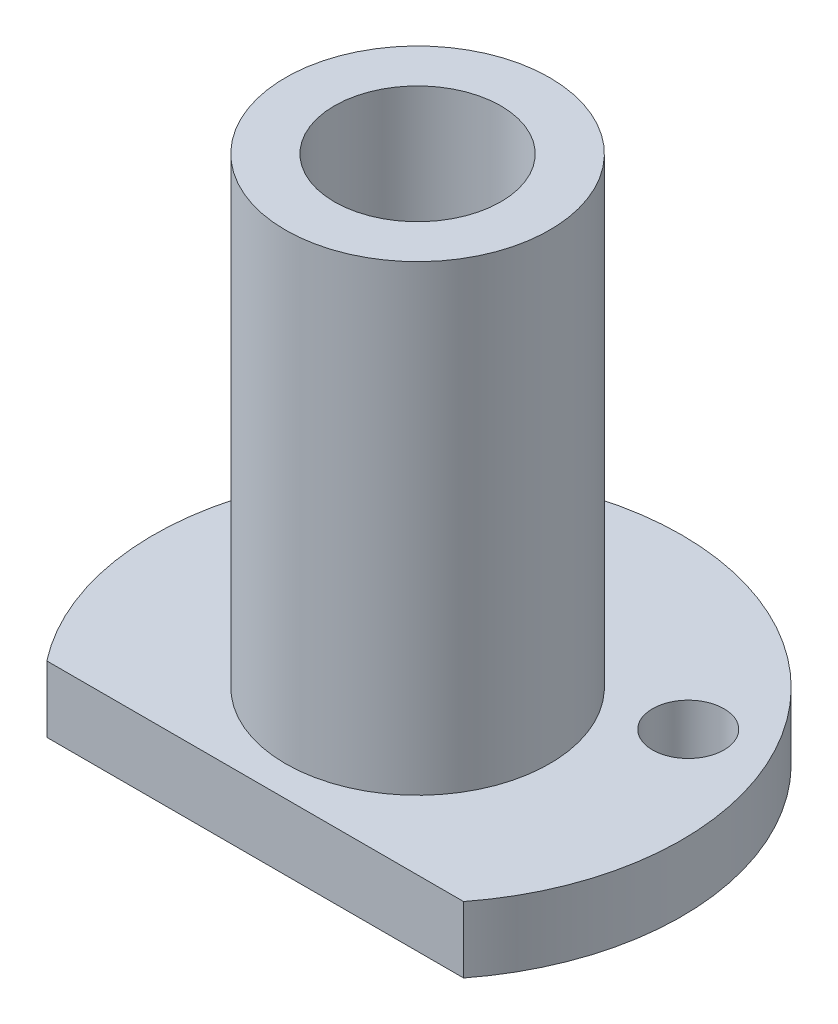
ISO-10303-21;
HEADER;
FILE_DESCRIPTION(('STEP AP214'),'2;1');
FILE_NAME('part.step','',(''),(''),'','','');
FILE_SCHEMA(('AUTOMOTIVE_DESIGN { 1 0 10303 214 1 1 1 1 }'));
ENDSEC;
DATA;
#1=APPLICATION_CONTEXT('core data for automotive mechanical design processes');
#2=APPLICATION_PROTOCOL_DEFINITION('international standard','automotive_design',2000,#1);
#3=PRODUCT_CONTEXT('',#1,'mechanical');
#4=PRODUCT('Part','Part','',(#3));
#5=PRODUCT_RELATED_PRODUCT_CATEGORY('part','',(#4));
#6=PRODUCT_DEFINITION_FORMATION('','',#4);
#7=PRODUCT_DEFINITION_CONTEXT('part definition',#1,'design');
#8=PRODUCT_DEFINITION('design','',#6,#7);
#9=PRODUCT_DEFINITION_SHAPE('','',#8);
#10=(LENGTH_UNIT() NAMED_UNIT(*) SI_UNIT(.MILLI.,.METRE.));
#11=(NAMED_UNIT(*) PLANE_ANGLE_UNIT() SI_UNIT($,.RADIAN.));
#12=(NAMED_UNIT(*) SI_UNIT($,.STERADIAN.) SOLID_ANGLE_UNIT());
#13=UNCERTAINTY_MEASURE_WITH_UNIT(LENGTH_MEASURE(1.E-05),#10,'distance_accuracy_value','');
#14=(GEOMETRIC_REPRESENTATION_CONTEXT(3) GLOBAL_UNCERTAINTY_ASSIGNED_CONTEXT((#13)) GLOBAL_UNIT_ASSIGNED_CONTEXT((#10,
#11,#12)) REPRESENTATION_CONTEXT('',''));
#15=CARTESIAN_POINT('',(0.,0.,0.));
#16=DIRECTION('',(0.,0.,1.));
#17=DIRECTION('',(1.,0.,0.));
#18=AXIS2_PLACEMENT_3D('',#15,#16,#17);
#19=CARTESIAN_POINT('',(0.,4.7752,0.));
#20=DIRECTION('',(0.,1.,0.));
#21=DIRECTION('',(0.,0.,1.));
#22=AXIS2_PLACEMENT_3D('',#19,#20,#21);
#23=PLANE('',#22);
#24=DIRECTION('',(1.,0.,0.));
#25=VECTOR('',#24,1.);
#26=CARTESIAN_POINT('',(-15.0263918370313,4.7752,11.7094));
#27=LINE('',#26,#25);
#28=CARTESIAN_POINT('',(-15.0263918370313,4.7752,11.7094));
#29=VERTEX_POINT('',#28);
#30=CARTESIAN_POINT('',(15.0263918370313,4.7752,11.7094));
#31=VERTEX_POINT('',#30);
#32=EDGE_CURVE('E57',#29,#31,#27,.T.);
#33=ORIENTED_EDGE('',*,*,#32,.T.);
#34=CARTESIAN_POINT('',(0.,4.7752,0.));
#35=DIRECTION('',(0.,1.,0.));
#36=DIRECTION('',(0.,0.,1.));
#37=AXIS2_PLACEMENT_3D('',#34,#35,#36);
#38=CIRCLE('',#37,19.05);
#39=EDGE_CURVE('E11',#31,#29,#38,.T.);
#40=ORIENTED_EDGE('',*,*,#39,.T.);
#41=EDGE_LOOP('',(#33,#40));
#42=FACE_BOUND('',#41,.T.);
#43=CARTESIAN_POINT('',(12.3733379565714,4.7752,-7.14374999999931));
#44=DIRECTION('',(0.,1.,0.));
#45=DIRECTION('',(0.,0.,1.));
#46=AXIS2_PLACEMENT_3D('',#43,#44,#45);
#47=CIRCLE('',#46,2.57810000000082);
#48=CARTESIAN_POINT('',(12.3733379565714,4.7752,-4.56564999999849));
#49=VERTEX_POINT('',#48);
#50=EDGE_CURVE('E73',#49,#49,#47,.F.);
#51=ORIENTED_EDGE('',*,*,#50,.T.);
#52=EDGE_LOOP('',(#51));
#53=FACE_BOUND('',#52,.T.);
#54=CARTESIAN_POINT('',(-12.373337956569,4.7752,-7.1437500000007));
#55=DIRECTION('',(0.,1.,0.));
#56=DIRECTION('',(0.,0.,1.));
#57=AXIS2_PLACEMENT_3D('',#54,#55,#56);
#58=CIRCLE('',#57,2.5781000000013);
#59=CARTESIAN_POINT('',(-12.373337956569,4.7752,-4.5656499999994));
#60=VERTEX_POINT('',#59);
#61=EDGE_CURVE('E77',#60,#60,#58,.F.);
#62=ORIENTED_EDGE('',*,*,#61,.T.);
#63=EDGE_LOOP('',(#62));
#64=FACE_BOUND('',#63,.T.);
#65=CARTESIAN_POINT('',(0.,4.7752,0.));
#66=DIRECTION('',(0.,1.,0.));
#67=DIRECTION('',(0.,0.,1.));
#68=AXIS2_PLACEMENT_3D('',#65,#66,#67);
#69=CIRCLE('',#68,9.525);
#70=CARTESIAN_POINT('',(0.,4.7752,9.525));
#71=VERTEX_POINT('',#70);
#72=EDGE_CURVE('E80',#71,#71,#69,.T.);
#73=ORIENTED_EDGE('',*,*,#72,.F.);
#74=EDGE_LOOP('',(#73));
#75=FACE_BOUND('',#74,.T.);
#76=ADVANCED_FACE('F32',(#42,#53,#64,#75),#23,.T.);
#77=CARTESIAN_POINT('',(0.,4.7752,0.));
#78=DIRECTION('',(0.,-1.,0.));
#79=DIRECTION('',(0.,0.,-1.));
#80=AXIS2_PLACEMENT_3D('',#77,#78,#79);
#81=CYLINDRICAL_SURFACE('',#80,19.05);
#82=ORIENTED_EDGE('',*,*,#39,.F.);
#83=DIRECTION('',(0.,-1.,0.));
#84=VECTOR('',#83,1.);
#85=CARTESIAN_POINT('',(15.0263918370313,38.101,11.7094));
#86=LINE('',#85,#84);
#87=CARTESIAN_POINT('',(15.0263918370313,0.,11.7094));
#88=VERTEX_POINT('',#87);
#89=EDGE_CURVE('E59',#31,#88,#86,.T.);
#90=ORIENTED_EDGE('',*,*,#89,.T.);
#91=CARTESIAN_POINT('',(0.,0.,0.));
#92=DIRECTION('',(0.,1.,0.));
#93=DIRECTION('',(0.,0.,1.));
#94=AXIS2_PLACEMENT_3D('',#91,#92,#93);
#95=CIRCLE('',#94,19.05);
#96=CARTESIAN_POINT('',(-15.0263918370313,0.,11.7094));
#97=VERTEX_POINT('',#96);
#98=EDGE_CURVE('E36',#88,#97,#95,.T.);
#99=ORIENTED_EDGE('',*,*,#98,.T.);
#100=DIRECTION('',(0.,-1.,0.));
#101=VECTOR('',#100,1.);
#102=CARTESIAN_POINT('',(-15.0263918370313,38.101,11.7094));
#103=LINE('',#102,#101);
#104=EDGE_CURVE('E47',#29,#97,#103,.T.);
#105=ORIENTED_EDGE('',*,*,#104,.F.);
#106=EDGE_LOOP('',(#82,#90,#99,#105));
#107=FACE_BOUND('',#106,.T.);
#108=ADVANCED_FACE('F34',(#107),#81,.T.);
#109=CARTESIAN_POINT('',(0.,0.,0.));
#110=DIRECTION('',(0.,1.,0.));
#111=DIRECTION('',(0.,0.,1.));
#112=AXIS2_PLACEMENT_3D('',#109,#110,#111);
#113=PLANE('',#112);
#114=CARTESIAN_POINT('',(0.,0.,0.));
#115=DIRECTION('',(0.,-1.,0.));
#116=DIRECTION('',(0.,0.,-1.));
#117=AXIS2_PLACEMENT_3D('',#114,#115,#116);
#118=CIRCLE('',#117,6.);
#119=CARTESIAN_POINT('',(0.,0.,-6.));
#120=VERTEX_POINT('',#119);
#121=EDGE_CURVE('E93',#120,#120,#118,.T.);
#122=ORIENTED_EDGE('',*,*,#121,.F.);
#123=EDGE_LOOP('',(#122));
#124=FACE_BOUND('',#123,.T.);
#125=CARTESIAN_POINT('',(12.3733379565714,0.,-7.14374999999931));
#126=DIRECTION('',(0.,-1.,0.));
#127=DIRECTION('',(0.,0.,-1.));
#128=AXIS2_PLACEMENT_3D('',#125,#126,#127);
#129=CIRCLE('',#128,2.57810000000082);
#130=CARTESIAN_POINT('',(12.3733379565714,0.,-9.72185000000013));
#131=VERTEX_POINT('',#130);
#132=EDGE_CURVE('E90',#131,#131,#129,.T.);
#133=ORIENTED_EDGE('',*,*,#132,.F.);
#134=EDGE_LOOP('',(#133));
#135=FACE_BOUND('',#134,.T.);
#136=CARTESIAN_POINT('',(-12.373337956569,0.,-7.1437500000007));
#137=DIRECTION('',(0.,-1.,0.));
#138=DIRECTION('',(0.,0.,-1.));
#139=AXIS2_PLACEMENT_3D('',#136,#137,#138);
#140=CIRCLE('',#139,2.5781000000013);
#141=CARTESIAN_POINT('',(-12.373337956569,0.,-9.72185000000199));
#142=VERTEX_POINT('',#141);
#143=EDGE_CURVE('E83',#142,#142,#140,.T.);
#144=ORIENTED_EDGE('',*,*,#143,.F.);
#145=EDGE_LOOP('',(#144));
#146=FACE_BOUND('',#145,.T.);
#147=ORIENTED_EDGE('',*,*,#98,.F.);
#148=DIRECTION('',(1.,0.,0.));
#149=VECTOR('',#148,1.);
#150=CARTESIAN_POINT('',(-15.0263918370313,0.,11.7094));
#151=LINE('',#150,#149);
#152=EDGE_CURVE('E51',#97,#88,#151,.T.);
#153=ORIENTED_EDGE('',*,*,#152,.F.);
#154=EDGE_LOOP('',(#147,#153));
#155=FACE_BOUND('',#154,.T.);
#156=ADVANCED_FACE('F103',(#124,#135,#146,#155),#113,.F.);
#157=CARTESIAN_POINT('',(0.,38.1,0.));
#158=DIRECTION('',(0.,-1.,0.));
#159=DIRECTION('',(0.,0.,-1.));
#160=AXIS2_PLACEMENT_3D('',#157,#158,#159);
#161=CYLINDRICAL_SURFACE('',#160,9.525);
#162=CARTESIAN_POINT('',(0.,38.1,0.));
#163=DIRECTION('',(0.,1.,0.));
#164=DIRECTION('',(0.,0.,1.));
#165=AXIS2_PLACEMENT_3D('',#162,#163,#164);
#166=CIRCLE('',#165,9.525);
#167=CARTESIAN_POINT('',(0.,38.1,9.525));
#168=VERTEX_POINT('',#167);
#169=EDGE_CURVE('E82',#168,#168,#166,.T.);
#170=ORIENTED_EDGE('',*,*,#169,.F.);
#171=EDGE_LOOP('',(#170));
#172=FACE_BOUND('',#171,.T.);
#173=ORIENTED_EDGE('',*,*,#72,.T.);
#174=EDGE_LOOP('',(#173));
#175=FACE_BOUND('',#174,.T.);
#176=ADVANCED_FACE('F105',(#172,#175),#161,.T.);
#177=CARTESIAN_POINT('',(0.,38.1,0.));
#178=DIRECTION('',(0.,1.,0.));
#179=DIRECTION('',(0.,0.,1.));
#180=AXIS2_PLACEMENT_3D('',#177,#178,#179);
#181=PLANE('',#180);
#182=CARTESIAN_POINT('',(0.,38.1,0.));
#183=DIRECTION('',(0.,1.,0.));
#184=DIRECTION('',(0.,0.,1.));
#185=AXIS2_PLACEMENT_3D('',#182,#183,#184);
#186=CIRCLE('',#185,6.);
#187=CARTESIAN_POINT('',(0.,38.1,6.));
#188=VERTEX_POINT('',#187);
#189=EDGE_CURVE('E96',#188,#188,#186,.F.);
#190=ORIENTED_EDGE('',*,*,#189,.T.);
#191=EDGE_LOOP('',(#190));
#192=FACE_BOUND('',#191,.T.);
#193=ORIENTED_EDGE('',*,*,#169,.T.);
#194=EDGE_LOOP('',(#193));
#195=FACE_BOUND('',#194,.T.);
#196=ADVANCED_FACE('F111',(#192,#195),#181,.T.);
#197=CARTESIAN_POINT('',(-12.373337956569,38.101,-7.1437500000007));
#198=DIRECTION('',(0.,-1.,0.));
#199=DIRECTION('',(0.,0.,-1.));
#200=AXIS2_PLACEMENT_3D('',#197,#198,#199);
#201=CYLINDRICAL_SURFACE('',#200,2.5781000000013);
#202=ORIENTED_EDGE('',*,*,#61,.F.);
#203=EDGE_LOOP('',(#202));
#204=FACE_BOUND('',#203,.T.);
#205=ORIENTED_EDGE('',*,*,#143,.T.);
#206=EDGE_LOOP('',(#205));
#207=FACE_BOUND('',#206,.T.);
#208=ADVANCED_FACE('F119',(#204,#207),#201,.F.);
#209=CARTESIAN_POINT('',(12.3733379565714,38.101,-7.14374999999931));
#210=DIRECTION('',(0.,-1.,0.));
#211=DIRECTION('',(0.,0.,-1.));
#212=AXIS2_PLACEMENT_3D('',#209,#210,#211);
#213=CYLINDRICAL_SURFACE('',#212,2.57810000000082);
#214=ORIENTED_EDGE('',*,*,#50,.F.);
#215=EDGE_LOOP('',(#214));
#216=FACE_BOUND('',#215,.T.);
#217=ORIENTED_EDGE('',*,*,#132,.T.);
#218=EDGE_LOOP('',(#217));
#219=FACE_BOUND('',#218,.T.);
#220=ADVANCED_FACE('F123',(#216,#219),#213,.F.);
#221=CARTESIAN_POINT('',(0.,38.101,0.));
#222=DIRECTION('',(0.,-1.,0.));
#223=DIRECTION('',(0.,0.,-1.));
#224=AXIS2_PLACEMENT_3D('',#221,#222,#223);
#225=CYLINDRICAL_SURFACE('',#224,6.);
#226=ORIENTED_EDGE('',*,*,#189,.F.);
#227=EDGE_LOOP('',(#226));
#228=FACE_BOUND('',#227,.T.);
#229=ORIENTED_EDGE('',*,*,#121,.T.);
#230=EDGE_LOOP('',(#229));
#231=FACE_BOUND('',#230,.T.);
#232=ADVANCED_FACE('F127',(#228,#231),#225,.F.);
#233=CARTESIAN_POINT('',(-15.0263918370313,38.101,11.7094));
#234=DIRECTION('',(0.,0.,-1.));
#235=DIRECTION('',(-1.,0.,0.));
#236=AXIS2_PLACEMENT_3D('',#233,#234,#235);
#237=PLANE('',#236);
#238=ORIENTED_EDGE('',*,*,#152,.T.);
#239=ORIENTED_EDGE('',*,*,#89,.F.);
#240=ORIENTED_EDGE('',*,*,#32,.F.);
#241=ORIENTED_EDGE('',*,*,#104,.T.);
#242=EDGE_LOOP('',(#238,#239,#240,#241));
#243=FACE_BOUND('',#242,.T.);
#244=ADVANCED_FACE('F58',(#243),#237,.F.);
#245=CLOSED_SHELL('',(#76,#108,#156,#176,#196,#208,#220,#232,#244));
#246=MANIFOLD_SOLID_BREP('B2',#245);
#247=ADVANCED_BREP_SHAPE_REPRESENTATION('',(#18,#246),#14);
#248=SHAPE_DEFINITION_REPRESENTATION(#9,#247);
ENDSEC;
END-ISO-10303-21;
